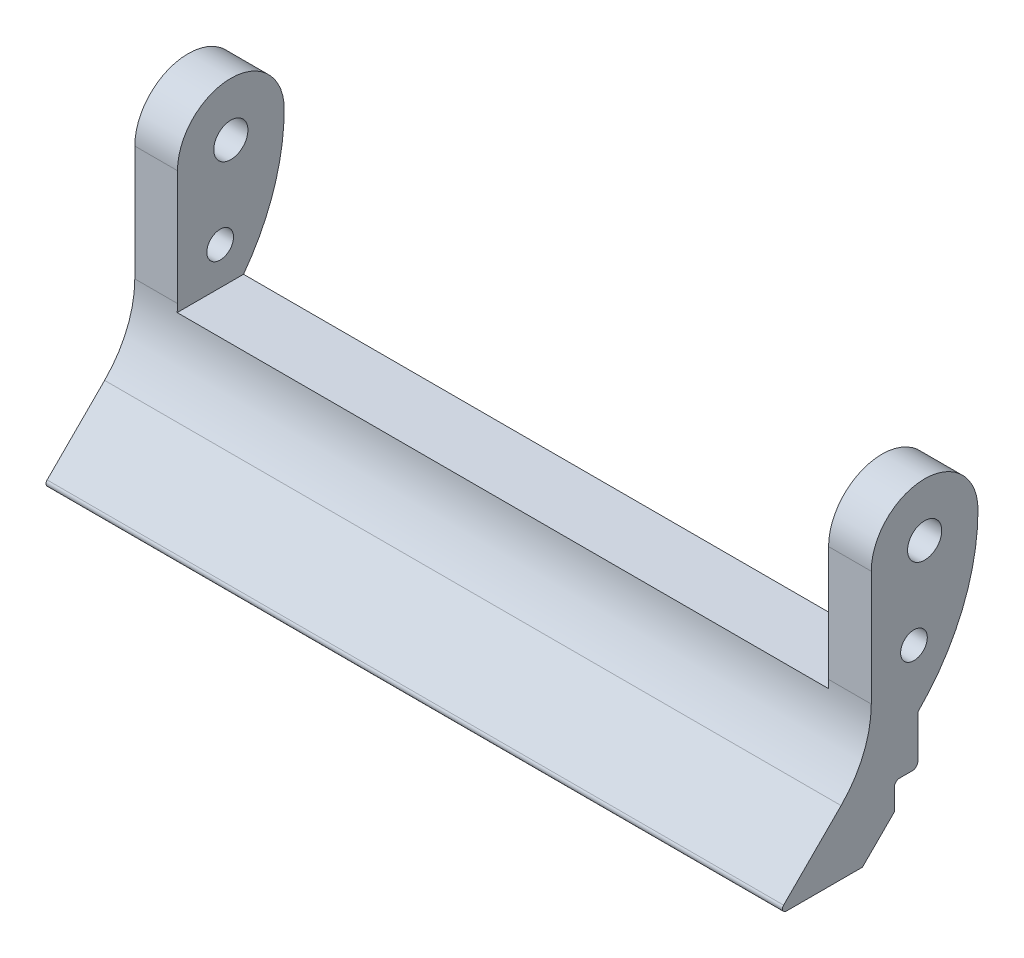
ISO-10303-21;
HEADER;
FILE_DESCRIPTION(('STEP AP214'),'2;1');
FILE_NAME('part.step','',(''),(''),'','','');
FILE_SCHEMA(('AUTOMOTIVE_DESIGN { 1 0 10303 214 1 1 1 1 }'));
ENDSEC;
DATA;
#1=APPLICATION_CONTEXT('core data for automotive mechanical design processes');
#2=APPLICATION_PROTOCOL_DEFINITION('international standard','automotive_design',2000,#1);
#3=PRODUCT_CONTEXT('',#1,'mechanical');
#4=PRODUCT('Part','Part','',(#3));
#5=PRODUCT_RELATED_PRODUCT_CATEGORY('part','',(#4));
#6=PRODUCT_DEFINITION_FORMATION('','',#4);
#7=PRODUCT_DEFINITION_CONTEXT('part definition',#1,'design');
#8=PRODUCT_DEFINITION('design','',#6,#7);
#9=PRODUCT_DEFINITION_SHAPE('','',#8);
#10=(LENGTH_UNIT() NAMED_UNIT(*) SI_UNIT(.MILLI.,.METRE.));
#11=(NAMED_UNIT(*) PLANE_ANGLE_UNIT() SI_UNIT($,.RADIAN.));
#12=(NAMED_UNIT(*) SI_UNIT($,.STERADIAN.) SOLID_ANGLE_UNIT());
#13=UNCERTAINTY_MEASURE_WITH_UNIT(LENGTH_MEASURE(1.E-05),#10,'distance_accuracy_value','');
#14=(GEOMETRIC_REPRESENTATION_CONTEXT(3) GLOBAL_UNCERTAINTY_ASSIGNED_CONTEXT((#13)) GLOBAL_UNIT_ASSIGNED_CONTEXT((#10,
#11,#12)) REPRESENTATION_CONTEXT('',''));
#15=CARTESIAN_POINT('',(0.,0.,0.));
#16=DIRECTION('',(0.,0.,1.));
#17=DIRECTION('',(1.,0.,0.));
#18=AXIS2_PLACEMENT_3D('',#15,#16,#17);
#19=CARTESIAN_POINT('',(69.,23.6,0.));
#20=DIRECTION('',(-1.,0.,0.));
#21=DIRECTION('',(0.,0.,1.));
#22=AXIS2_PLACEMENT_3D('',#19,#20,#21);
#23=CYLINDRICAL_SURFACE('',#22,5.);
#24=CARTESIAN_POINT('',(4.,23.6,0.));
#25=DIRECTION('',(1.,0.,0.));
#26=DIRECTION('',(0.,0.,-1.));
#27=AXIS2_PLACEMENT_3D('',#24,#25,#26);
#28=CIRCLE('',#27,5.);
#29=CARTESIAN_POINT('',(4.,23.6,-4.99999999999999));
#30=VERTEX_POINT('',#29);
#31=CARTESIAN_POINT('',(4.,23.6,5.00000000000001));
#32=VERTEX_POINT('',#31);
#33=EDGE_CURVE('E263',#30,#32,#28,.T.);
#34=ORIENTED_EDGE('',*,*,#33,.F.);
#35=DIRECTION('',(-1.,0.,0.));
#36=VECTOR('',#35,1.);
#37=CARTESIAN_POINT('',(69.,23.6,-4.99999999999999));
#38=LINE('',#37,#36);
#39=CARTESIAN_POINT('',(0.,23.6,-4.99999999999999));
#40=VERTEX_POINT('',#39);
#41=EDGE_CURVE('E116',#30,#40,#38,.T.);
#42=ORIENTED_EDGE('',*,*,#41,.T.);
#43=CARTESIAN_POINT('',(0.,23.6,0.));
#44=DIRECTION('',(1.,0.,0.));
#45=DIRECTION('',(0.,0.,1.));
#46=AXIS2_PLACEMENT_3D('',#43,#44,#45);
#47=CIRCLE('',#46,5.);
#48=CARTESIAN_POINT('',(0.,23.6,5.00000000000001));
#49=VERTEX_POINT('',#48);
#50=EDGE_CURVE('E184',#40,#49,#47,.T.);
#51=ORIENTED_EDGE('',*,*,#50,.T.);
#52=DIRECTION('',(-1.,0.,0.));
#53=VECTOR('',#52,1.);
#54=CARTESIAN_POINT('',(69.,23.6,5.00000000000001));
#55=LINE('',#54,#53);
#56=EDGE_CURVE('E242',#32,#49,#55,.T.);
#57=ORIENTED_EDGE('',*,*,#56,.F.);
#58=EDGE_LOOP('',(#34,#42,#51,#57));
#59=FACE_BOUND('',#58,.T.);
#60=ADVANCED_FACE('F43',(#59),#23,.T.);
#61=CARTESIAN_POINT('',(69.,23.6,5.00000000000001));
#62=DIRECTION('',(0.,0.,-1.));
#63=DIRECTION('',(0.,1.,0.));
#64=AXIS2_PLACEMENT_3D('',#61,#62,#63);
#65=PLANE('',#64);
#66=DIRECTION('',(0.,-1.,0.));
#67=VECTOR('',#66,1.);
#68=CARTESIAN_POINT('',(4.,23.6,5.00000000000001));
#69=LINE('',#68,#67);
#70=CARTESIAN_POINT('',(4.,12.8235804371885,4.99999999999999));
#71=VERTEX_POINT('',#70);
#72=EDGE_CURVE('E258',#32,#71,#69,.T.);
#73=ORIENTED_EDGE('',*,*,#72,.F.);
#74=ORIENTED_EDGE('',*,*,#56,.T.);
#75=DIRECTION('',(0.,-1.,0.));
#76=VECTOR('',#75,1.);
#77=CARTESIAN_POINT('',(0.,23.6,5.00000000000001));
#78=LINE('',#77,#76);
#79=CARTESIAN_POINT('',(0.,12.8235804371885,4.99999999999999));
#80=VERTEX_POINT('',#79);
#81=EDGE_CURVE('E186',#49,#80,#78,.T.);
#82=ORIENTED_EDGE('',*,*,#81,.T.);
#83=DIRECTION('',(-1.,0.,0.));
#84=VECTOR('',#83,1.);
#85=CARTESIAN_POINT('',(69.,12.8235804371885,4.99999999999999));
#86=LINE('',#85,#84);
#87=EDGE_CURVE('E238',#71,#80,#86,.T.);
#88=ORIENTED_EDGE('',*,*,#87,.F.);
#89=EDGE_LOOP('',(#73,#74,#82,#88));
#90=FACE_BOUND('',#89,.T.);
#91=ADVANCED_FACE('F361',(#90),#65,.F.);
#92=CARTESIAN_POINT('',(69.,23.6,0.));
#93=DIRECTION('',(-1.,0.,0.));
#94=DIRECTION('',(0.,0.,1.));
#95=AXIS2_PLACEMENT_3D('',#92,#93,#94);
#96=CYLINDRICAL_SURFACE('',#95,1.6);
#97=CARTESIAN_POINT('',(0.,23.6,0.));
#98=DIRECTION('',(1.,0.,0.));
#99=DIRECTION('',(0.,0.,-1.));
#100=AXIS2_PLACEMENT_3D('',#97,#98,#99);
#101=CIRCLE('',#100,1.6);
#102=CARTESIAN_POINT('',(0.,23.6,-1.59999999999999));
#103=VERTEX_POINT('',#102);
#104=EDGE_CURVE('E278',#103,#103,#101,.T.);
#105=ORIENTED_EDGE('',*,*,#104,.F.);
#106=EDGE_LOOP('',(#105));
#107=FACE_BOUND('',#106,.T.);
#108=CARTESIAN_POINT('',(4.,23.6,0.));
#109=DIRECTION('',(1.,0.,0.));
#110=DIRECTION('',(0.,0.,-1.));
#111=AXIS2_PLACEMENT_3D('',#108,#109,#110);
#112=CIRCLE('',#111,1.6);
#113=CARTESIAN_POINT('',(4.,23.6,-1.59999999999999));
#114=VERTEX_POINT('',#113);
#115=EDGE_CURVE('E244',#114,#114,#112,.T.);
#116=ORIENTED_EDGE('',*,*,#115,.T.);
#117=EDGE_LOOP('',(#116));
#118=FACE_BOUND('',#117,.T.);
#119=ADVANCED_FACE('F400',(#107,#118),#96,.F.);
#120=CARTESIAN_POINT('',(69.,23.6,0.));
#121=DIRECTION('',(-1.,0.,0.));
#122=DIRECTION('',(0.,0.,1.));
#123=AXIS2_PLACEMENT_3D('',#120,#121,#122);
#124=PLANE('',#123);
#125=CARTESIAN_POINT('',(69.,15.6,0.999999999999999));
#126=DIRECTION('',(1.,0.,0.));
#127=DIRECTION('',(0.,0.,-1.));
#128=AXIS2_PLACEMENT_3D('',#125,#126,#127);
#129=CIRCLE('',#128,1.24999999999999);
#130=CARTESIAN_POINT('',(69.,15.6,-0.249999999999988));
#131=VERTEX_POINT('',#130);
#132=EDGE_CURVE('E392',#131,#131,#129,.T.);
#133=ORIENTED_EDGE('',*,*,#132,.F.);
#134=EDGE_LOOP('',(#133));
#135=FACE_BOUND('',#134,.T.);
#136=CARTESIAN_POINT('',(69.,23.6,0.));
#137=DIRECTION('',(1.,0.,0.));
#138=DIRECTION('',(0.,0.,1.));
#139=AXIS2_PLACEMENT_3D('',#136,#137,#138);
#140=CIRCLE('',#139,5.);
#141=CARTESIAN_POINT('',(69.,23.6,-4.99999999999999));
#142=VERTEX_POINT('',#141);
#143=CARTESIAN_POINT('',(69.,23.6,5.00000000000001));
#144=VERTEX_POINT('',#143);
#145=EDGE_CURVE('E211',#142,#144,#140,.T.);
#146=ORIENTED_EDGE('',*,*,#145,.T.);
#147=DIRECTION('',(0.,-1.,0.));
#148=VECTOR('',#147,1.);
#149=CARTESIAN_POINT('',(69.,23.6,5.00000000000001));
#150=LINE('',#149,#148);
#151=CARTESIAN_POINT('',(69.,12.8235804371885,4.99999999999999));
#152=VERTEX_POINT('',#151);
#153=EDGE_CURVE('E125',#144,#152,#150,.T.);
#154=ORIENTED_EDGE('',*,*,#153,.T.);
#155=CARTESIAN_POINT('',(69.,12.8235804371885,14.65));
#156=DIRECTION('',(-1.,0.,0.));
#157=DIRECTION('',(0.,0.,-1.));
#158=AXIS2_PLACEMENT_3D('',#155,#156,#157);
#159=CIRCLE('',#158,9.64999999999999);
#160=CARTESIAN_POINT('',(69.,5.99999999873836,7.82641956154979));
#161=VERTEX_POINT('',#160);
#162=EDGE_CURVE('E285',#152,#161,#159,.T.);
#163=ORIENTED_EDGE('',*,*,#162,.T.);
#164=DIRECTION('',(0.,-0.707106781186548,0.707106781186547));
#165=VECTOR('',#164,1.);
#166=CARTESIAN_POINT('',(69.,0.614558441227197,13.211861119061));
#167=LINE('',#166,#165);
#168=CARTESIAN_POINT('',(69.,0.614558441227197,13.211861119061));
#169=VERTEX_POINT('',#168);
#170=EDGE_CURVE('E287',#161,#169,#167,.T.);
#171=ORIENTED_EDGE('',*,*,#170,.T.);
#172=CARTESIAN_POINT('',(69.,0.36,12.9573026778338));
#173=DIRECTION('',(1.,0.,0.));
#174=DIRECTION('',(0.,0.,-1.));
#175=AXIS2_PLACEMENT_3D('',#172,#173,#174);
#176=CIRCLE('',#175,0.360000000000032);
#177=CARTESIAN_POINT('',(69.,0.,12.9573026778338));
#178=VERTEX_POINT('',#177);
#179=EDGE_CURVE('E289',#169,#178,#176,.T.);
#180=ORIENTED_EDGE('',*,*,#179,.T.);
#181=DIRECTION('',(0.,0.,-1.));
#182=VECTOR('',#181,1.);
#183=CARTESIAN_POINT('',(69.,0.,12.9573026778338));
#184=LINE('',#183,#182);
#185=CARTESIAN_POINT('',(69.,0.,5.82641955783378));
#186=VERTEX_POINT('',#185);
#187=EDGE_CURVE('E291',#178,#186,#184,.T.);
#188=ORIENTED_EDGE('',*,*,#187,.T.);
#189=DIRECTION('',(0.,0.707106781186551,-0.707106781186544));
#190=VECTOR('',#189,1.);
#191=CARTESIAN_POINT('',(69.,0.,5.82641955783378));
#192=LINE('',#191,#190);
#193=CARTESIAN_POINT('',(69.,2.98549772000003,2.84092183783378));
#194=VERTEX_POINT('',#193);
#195=EDGE_CURVE('E293',#186,#194,#192,.T.);
#196=ORIENTED_EDGE('',*,*,#195,.T.);
#197=DIRECTION('',(0.,1.,0.));
#198=VECTOR('',#197,1.);
#199=CARTESIAN_POINT('',(69.,2.98549772000003,2.84092183783378));
#200=LINE('',#199,#198);
#201=CARTESIAN_POINT('',(69.,4.98549772000003,2.84092183783378));
#202=VERTEX_POINT('',#201);
#203=EDGE_CURVE('E295',#194,#202,#200,.T.);
#204=ORIENTED_EDGE('',*,*,#203,.T.);
#205=CARTESIAN_POINT('',(69.,4.98549772000003,2.34092183783378));
#206=DIRECTION('',(-1.,0.,0.));
#207=DIRECTION('',(0.,0.,1.));
#208=AXIS2_PLACEMENT_3D('',#205,#206,#207);
#209=CIRCLE('',#208,0.499999999999999);
#210=CARTESIAN_POINT('',(69.,5.48549772000003,2.34092183783378));
#211=VERTEX_POINT('',#210);
#212=EDGE_CURVE('E297',#202,#211,#209,.T.);
#213=ORIENTED_EDGE('',*,*,#212,.T.);
#214=DIRECTION('',(0.,0.,-1.));
#215=VECTOR('',#214,1.);
#216=CARTESIAN_POINT('',(69.,5.48549772000003,2.34092183783378));
#217=LINE('',#216,#215);
#218=CARTESIAN_POINT('',(69.,5.48549772000002,1.13931148933537));
#219=VERTEX_POINT('',#218);
#220=EDGE_CURVE('E163',#211,#219,#217,.T.);
#221=ORIENTED_EDGE('',*,*,#220,.T.);
#222=CARTESIAN_POINT('',(69.,5.98549772000002,1.13931148933537));
#223=DIRECTION('',(1.,0.,0.));
#224=DIRECTION('',(0.,0.,-1.));
#225=AXIS2_PLACEMENT_3D('',#222,#223,#224);
#226=CIRCLE('',#225,0.5);
#227=CARTESIAN_POINT('',(69.,5.98549772000002,0.639311489335374));
#228=VERTEX_POINT('',#227);
#229=EDGE_CURVE('E155',#219,#228,#226,.T.);
#230=ORIENTED_EDGE('',*,*,#229,.T.);
#231=DIRECTION('',(0.,1.,0.));
#232=VECTOR('',#231,1.);
#233=CARTESIAN_POINT('',(69.,5.98549772000002,0.639311489335374));
#234=LINE('',#233,#232);
#235=CARTESIAN_POINT('',(69.,9.98549772000002,0.639311489335375));
#236=VERTEX_POINT('',#235);
#237=EDGE_CURVE('E160',#228,#236,#234,.T.);
#238=ORIENTED_EDGE('',*,*,#237,.T.);
#239=CARTESIAN_POINT('',(69.,23.6,14.2538137693355));
#240=DIRECTION('',(1.,0.,0.));
#241=DIRECTION('',(0.,0.,-1.));
#242=AXIS2_PLACEMENT_3D('',#239,#240,#241);
#243=CIRCLE('',#242,19.2538137693355);
#244=EDGE_CURVE('E67',#236,#142,#243,.T.);
#245=ORIENTED_EDGE('',*,*,#244,.T.);
#246=EDGE_LOOP('',(#146,#154,#163,#171,#180,#188,#196,#204,#213,#221,#230,#238,#245));
#247=FACE_BOUND('',#246,.T.);
#248=CARTESIAN_POINT('',(69.,23.6,0.));
#249=DIRECTION('',(1.,0.,0.));
#250=DIRECTION('',(0.,0.,-1.));
#251=AXIS2_PLACEMENT_3D('',#248,#249,#250);
#252=CIRCLE('',#251,1.6);
#253=CARTESIAN_POINT('',(69.,23.6,-1.59999999999999));
#254=VERTEX_POINT('',#253);
#255=EDGE_CURVE('E187',#254,#254,#252,.T.);
#256=ORIENTED_EDGE('',*,*,#255,.F.);
#257=EDGE_LOOP('',(#256));
#258=FACE_BOUND('',#257,.T.);
#259=ADVANCED_FACE('F157',(#135,#247,#258),#124,.F.);
#260=CARTESIAN_POINT('',(0.,23.6,0.));
#261=DIRECTION('',(-1.,0.,0.));
#262=DIRECTION('',(0.,0.,1.));
#263=AXIS2_PLACEMENT_3D('',#260,#261,#262);
#264=PLANE('',#263);
#265=CARTESIAN_POINT('',(0.,15.6,0.999999999999999));
#266=DIRECTION('',(1.,0.,0.));
#267=DIRECTION('',(0.,0.,-1.));
#268=AXIS2_PLACEMENT_3D('',#265,#266,#267);
#269=CIRCLE('',#268,1.24999999999998);
#270=CARTESIAN_POINT('',(0.,15.6,-0.249999999999985));
#271=VERTEX_POINT('',#270);
#272=EDGE_CURVE('E389',#271,#271,#269,.T.);
#273=ORIENTED_EDGE('',*,*,#272,.T.);
#274=EDGE_LOOP('',(#273));
#275=FACE_BOUND('',#274,.T.);
#276=ORIENTED_EDGE('',*,*,#50,.F.);
#277=CARTESIAN_POINT('',(0.,23.6,14.2538137693355));
#278=DIRECTION('',(1.,0.,0.));
#279=DIRECTION('',(0.,0.,-1.));
#280=AXIS2_PLACEMENT_3D('',#277,#278,#279);
#281=CIRCLE('',#280,19.2538137693355);
#282=CARTESIAN_POINT('',(0.,9.98549772000002,0.639311489335375));
#283=VERTEX_POINT('',#282);
#284=EDGE_CURVE('E209',#283,#40,#281,.T.);
#285=ORIENTED_EDGE('',*,*,#284,.F.);
#286=DIRECTION('',(0.,1.,0.));
#287=VECTOR('',#286,1.);
#288=CARTESIAN_POINT('',(0.,5.98549772000002,0.639311489335374));
#289=LINE('',#288,#287);
#290=CARTESIAN_POINT('',(0.,5.98549772000002,0.639311489335374));
#291=VERTEX_POINT('',#290);
#292=EDGE_CURVE('E207',#291,#283,#289,.T.);
#293=ORIENTED_EDGE('',*,*,#292,.F.);
#294=CARTESIAN_POINT('',(0.,5.98549772000002,1.13931148933537));
#295=DIRECTION('',(1.,0.,0.));
#296=DIRECTION('',(0.,0.,-1.));
#297=AXIS2_PLACEMENT_3D('',#294,#295,#296);
#298=CIRCLE('',#297,0.5);
#299=CARTESIAN_POINT('',(0.,5.48549772000002,1.13931148933537));
#300=VERTEX_POINT('',#299);
#301=EDGE_CURVE('E172',#300,#291,#298,.T.);
#302=ORIENTED_EDGE('',*,*,#301,.F.);
#303=DIRECTION('',(0.,0.,-1.));
#304=VECTOR('',#303,1.);
#305=CARTESIAN_POINT('',(0.,5.48549772000003,2.34092183783378));
#306=LINE('',#305,#304);
#307=CARTESIAN_POINT('',(0.,5.48549772000003,2.34092183783378));
#308=VERTEX_POINT('',#307);
#309=EDGE_CURVE('E204',#308,#300,#306,.T.);
#310=ORIENTED_EDGE('',*,*,#309,.F.);
#311=CARTESIAN_POINT('',(0.,4.98549772000003,2.34092183783378));
#312=DIRECTION('',(-1.,0.,0.));
#313=DIRECTION('',(0.,0.,1.));
#314=AXIS2_PLACEMENT_3D('',#311,#312,#313);
#315=CIRCLE('',#314,0.499999999999999);
#316=CARTESIAN_POINT('',(0.,4.98549772000003,2.84092183783378));
#317=VERTEX_POINT('',#316);
#318=EDGE_CURVE('E202',#317,#308,#315,.T.);
#319=ORIENTED_EDGE('',*,*,#318,.F.);
#320=DIRECTION('',(0.,1.,0.));
#321=VECTOR('',#320,1.);
#322=CARTESIAN_POINT('',(0.,2.98549772000003,2.84092183783378));
#323=LINE('',#322,#321);
#324=CARTESIAN_POINT('',(0.,2.98549772000003,2.84092183783378));
#325=VERTEX_POINT('',#324);
#326=EDGE_CURVE('E200',#325,#317,#323,.T.);
#327=ORIENTED_EDGE('',*,*,#326,.F.);
#328=DIRECTION('',(0.,0.707106781186551,-0.707106781186544));
#329=VECTOR('',#328,1.);
#330=CARTESIAN_POINT('',(0.,0.,5.82641955783378));
#331=LINE('',#330,#329);
#332=CARTESIAN_POINT('',(0.,0.,5.82641955783378));
#333=VERTEX_POINT('',#332);
#334=EDGE_CURVE('E198',#333,#325,#331,.T.);
#335=ORIENTED_EDGE('',*,*,#334,.F.);
#336=DIRECTION('',(0.,0.,-1.));
#337=VECTOR('',#336,1.);
#338=CARTESIAN_POINT('',(0.,0.,12.9573026778338));
#339=LINE('',#338,#337);
#340=CARTESIAN_POINT('',(0.,0.,12.9573026778338));
#341=VERTEX_POINT('',#340);
#342=EDGE_CURVE('E196',#341,#333,#339,.T.);
#343=ORIENTED_EDGE('',*,*,#342,.F.);
#344=CARTESIAN_POINT('',(0.,0.36,12.9573026778338));
#345=DIRECTION('',(1.,0.,0.));
#346=DIRECTION('',(0.,0.,-1.));
#347=AXIS2_PLACEMENT_3D('',#344,#345,#346);
#348=CIRCLE('',#347,0.360000000000032);
#349=CARTESIAN_POINT('',(0.,0.614558441227197,13.211861119061));
#350=VERTEX_POINT('',#349);
#351=EDGE_CURVE('E194',#350,#341,#348,.T.);
#352=ORIENTED_EDGE('',*,*,#351,.F.);
#353=DIRECTION('',(0.,-0.707106781186548,0.707106781186547));
#354=VECTOR('',#353,1.);
#355=CARTESIAN_POINT('',(0.,0.614558441227197,13.211861119061));
#356=LINE('',#355,#354);
#357=CARTESIAN_POINT('',(0.,5.99999999873836,7.82641956154979));
#358=VERTEX_POINT('',#357);
#359=EDGE_CURVE('E192',#358,#350,#356,.T.);
#360=ORIENTED_EDGE('',*,*,#359,.F.);
#361=CARTESIAN_POINT('',(0.,12.8235804371885,14.65));
#362=DIRECTION('',(-1.,0.,0.));
#363=DIRECTION('',(0.,0.,-1.));
#364=AXIS2_PLACEMENT_3D('',#361,#362,#363);
#365=CIRCLE('',#364,9.64999999999999);
#366=EDGE_CURVE('E190',#80,#358,#365,.T.);
#367=ORIENTED_EDGE('',*,*,#366,.F.);
#368=ORIENTED_EDGE('',*,*,#81,.F.);
#369=EDGE_LOOP('',(#276,#285,#293,#302,#310,#319,#327,#335,#343,#352,#360,#367,#368));
#370=FACE_BOUND('',#369,.T.);
#371=ORIENTED_EDGE('',*,*,#104,.T.);
#372=EDGE_LOOP('',(#371));
#373=FACE_BOUND('',#372,.T.);
#374=ADVANCED_FACE('F310',(#275,#370,#373),#264,.T.);
#375=CARTESIAN_POINT('',(65.,23.6,-4.99999999999999));
#376=VERTEX_POINT('',#375);
#377=EDGE_CURVE('E212',#142,#376,#38,.T.);
#378=ORIENTED_EDGE('',*,*,#377,.T.);
#379=CARTESIAN_POINT('',(65.,23.6,0.));
#380=DIRECTION('',(1.,0.,0.));
#381=DIRECTION('',(0.,0.,-1.));
#382=AXIS2_PLACEMENT_3D('',#379,#380,#381);
#383=CIRCLE('',#382,5.);
#384=CARTESIAN_POINT('',(65.,23.6,5.00000000000001));
#385=VERTEX_POINT('',#384);
#386=EDGE_CURVE('E256',#376,#385,#383,.T.);
#387=ORIENTED_EDGE('',*,*,#386,.T.);
#388=EDGE_CURVE('E52',#144,#385,#55,.T.);
#389=ORIENTED_EDGE('',*,*,#388,.F.);
#390=ORIENTED_EDGE('',*,*,#145,.F.);
#391=EDGE_LOOP('',(#378,#387,#389,#390));
#392=FACE_BOUND('',#391,.T.);
#393=ADVANCED_FACE('F45',(#392),#23,.T.);
#394=ORIENTED_EDGE('',*,*,#388,.T.);
#395=DIRECTION('',(0.,-1.,0.));
#396=VECTOR('',#395,1.);
#397=CARTESIAN_POINT('',(65.,23.6,5.00000000000001));
#398=LINE('',#397,#396);
#399=CARTESIAN_POINT('',(65.,12.8235804371885,4.99999999999999));
#400=VERTEX_POINT('',#399);
#401=EDGE_CURVE('E269',#385,#400,#398,.T.);
#402=ORIENTED_EDGE('',*,*,#401,.T.);
#403=EDGE_CURVE('E239',#152,#400,#86,.T.);
#404=ORIENTED_EDGE('',*,*,#403,.F.);
#405=ORIENTED_EDGE('',*,*,#153,.F.);
#406=EDGE_LOOP('',(#394,#402,#404,#405));
#407=FACE_BOUND('',#406,.T.);
#408=ADVANCED_FACE('F323',(#407),#65,.F.);
#409=CARTESIAN_POINT('',(69.,12.8235804371885,14.65));
#410=DIRECTION('',(-1.,0.,0.));
#411=DIRECTION('',(0.,0.,1.));
#412=AXIS2_PLACEMENT_3D('',#409,#410,#411);
#413=CYLINDRICAL_SURFACE('',#412,9.64999999999999);
#414=ORIENTED_EDGE('',*,*,#403,.T.);
#415=CARTESIAN_POINT('',(65.,12.8235804371885,14.65));
#416=DIRECTION('',(1.,0.,0.));
#417=DIRECTION('',(0.,0.,-1.));
#418=AXIS2_PLACEMENT_3D('',#415,#416,#417);
#419=CIRCLE('',#418,9.64999999999999);
#420=CARTESIAN_POINT('',(65.,12.1,5.02716614759883));
#421=VERTEX_POINT('',#420);
#422=EDGE_CURVE('E272',#400,#421,#419,.F.);
#423=ORIENTED_EDGE('',*,*,#422,.T.);
#424=DIRECTION('',(-1.,0.,0.));
#425=VECTOR('',#424,1.);
#426=CARTESIAN_POINT('',(69.,12.1,5.02716614759883));
#427=LINE('',#426,#425);
#428=CARTESIAN_POINT('',(4.,12.1,5.02716614759883));
#429=VERTEX_POINT('',#428);
#430=EDGE_CURVE('E275',#429,#421,#427,.F.);
#431=ORIENTED_EDGE('',*,*,#430,.F.);
#432=CARTESIAN_POINT('',(4.,12.8235804371885,14.65));
#433=DIRECTION('',(1.,0.,0.));
#434=DIRECTION('',(0.,0.,-1.));
#435=AXIS2_PLACEMENT_3D('',#432,#433,#434);
#436=CIRCLE('',#435,9.64999999999999);
#437=EDGE_CURVE('E252',#71,#429,#436,.F.);
#438=ORIENTED_EDGE('',*,*,#437,.F.);
#439=ORIENTED_EDGE('',*,*,#87,.T.);
#440=ORIENTED_EDGE('',*,*,#366,.T.);
#441=DIRECTION('',(-1.,0.,0.));
#442=VECTOR('',#441,1.);
#443=CARTESIAN_POINT('',(69.,5.99999999873836,7.82641956154979));
#444=LINE('',#443,#442);
#445=EDGE_CURVE('E235',#161,#358,#444,.T.);
#446=ORIENTED_EDGE('',*,*,#445,.F.);
#447=ORIENTED_EDGE('',*,*,#162,.F.);
#448=EDGE_LOOP('',(#414,#423,#431,#438,#439,#440,#446,#447));
#449=FACE_BOUND('',#448,.T.);
#450=ADVANCED_FACE('F326',(#449),#413,.F.);
#451=CARTESIAN_POINT('',(69.,0.614558441227197,13.211861119061));
#452=DIRECTION('',(0.,-0.707106781186547,-0.707106781186548));
#453=DIRECTION('',(0.,0.707106781186548,-0.707106781186547));
#454=AXIS2_PLACEMENT_3D('',#451,#452,#453);
#455=PLANE('',#454);
#456=ORIENTED_EDGE('',*,*,#359,.T.);
#457=DIRECTION('',(-1.,0.,0.));
#458=VECTOR('',#457,1.);
#459=CARTESIAN_POINT('',(69.,0.614558441227197,13.211861119061));
#460=LINE('',#459,#458);
#461=EDGE_CURVE('E232',#169,#350,#460,.T.);
#462=ORIENTED_EDGE('',*,*,#461,.F.);
#463=ORIENTED_EDGE('',*,*,#170,.F.);
#464=ORIENTED_EDGE('',*,*,#445,.T.);
#465=EDGE_LOOP('',(#456,#462,#463,#464));
#466=FACE_BOUND('',#465,.T.);
#467=ADVANCED_FACE('F332',(#466),#455,.F.);
#468=CARTESIAN_POINT('',(69.,0.36,12.9573026778338));
#469=DIRECTION('',(-1.,0.,0.));
#470=DIRECTION('',(0.,0.,1.));
#471=AXIS2_PLACEMENT_3D('',#468,#469,#470);
#472=CYLINDRICAL_SURFACE('',#471,0.360000000000032);
#473=ORIENTED_EDGE('',*,*,#351,.T.);
#474=DIRECTION('',(-1.,0.,0.));
#475=VECTOR('',#474,1.);
#476=CARTESIAN_POINT('',(69.,0.,12.9573026778338));
#477=LINE('',#476,#475);
#478=EDGE_CURVE('E229',#178,#341,#477,.T.);
#479=ORIENTED_EDGE('',*,*,#478,.F.);
#480=ORIENTED_EDGE('',*,*,#179,.F.);
#481=ORIENTED_EDGE('',*,*,#461,.T.);
#482=EDGE_LOOP('',(#473,#479,#480,#481));
#483=FACE_BOUND('',#482,.T.);
#484=ADVANCED_FACE('F338',(#483),#472,.T.);
#485=CARTESIAN_POINT('',(69.,0.,12.9573026778338));
#486=DIRECTION('',(0.,1.,0.));
#487=DIRECTION('',(0.,0.,1.));
#488=AXIS2_PLACEMENT_3D('',#485,#486,#487);
#489=PLANE('',#488);
#490=ORIENTED_EDGE('',*,*,#342,.T.);
#491=DIRECTION('',(-1.,0.,0.));
#492=VECTOR('',#491,1.);
#493=CARTESIAN_POINT('',(69.,0.,5.82641955783378));
#494=LINE('',#493,#492);
#495=EDGE_CURVE('E226',#186,#333,#494,.T.);
#496=ORIENTED_EDGE('',*,*,#495,.F.);
#497=ORIENTED_EDGE('',*,*,#187,.F.);
#498=ORIENTED_EDGE('',*,*,#478,.T.);
#499=EDGE_LOOP('',(#490,#496,#497,#498));
#500=FACE_BOUND('',#499,.T.);
#501=ADVANCED_FACE('F342',(#500),#489,.F.);
#502=CARTESIAN_POINT('',(69.,0.,5.82641955783378));
#503=DIRECTION('',(0.,0.707106781186544,0.707106781186551));
#504=DIRECTION('',(0.,-0.707106781186551,0.707106781186544));
#505=AXIS2_PLACEMENT_3D('',#502,#503,#504);
#506=PLANE('',#505);
#507=ORIENTED_EDGE('',*,*,#334,.T.);
#508=DIRECTION('',(-1.,0.,0.));
#509=VECTOR('',#508,1.);
#510=CARTESIAN_POINT('',(69.,2.98549772000003,2.84092183783378));
#511=LINE('',#510,#509);
#512=EDGE_CURVE('E223',#194,#325,#511,.T.);
#513=ORIENTED_EDGE('',*,*,#512,.F.);
#514=ORIENTED_EDGE('',*,*,#195,.F.);
#515=ORIENTED_EDGE('',*,*,#495,.T.);
#516=EDGE_LOOP('',(#507,#513,#514,#515));
#517=FACE_BOUND('',#516,.T.);
#518=ADVANCED_FACE('F347',(#517),#506,.F.);
#519=CARTESIAN_POINT('',(69.,2.98549772000003,2.84092183783378));
#520=DIRECTION('',(0.,0.,1.));
#521=DIRECTION('',(1.,0.,0.));
#522=AXIS2_PLACEMENT_3D('',#519,#520,#521);
#523=PLANE('',#522);
#524=ORIENTED_EDGE('',*,*,#326,.T.);
#525=DIRECTION('',(-1.,0.,0.));
#526=VECTOR('',#525,1.);
#527=CARTESIAN_POINT('',(69.,4.98549772000003,2.84092183783378));
#528=LINE('',#527,#526);
#529=EDGE_CURVE('E220',#202,#317,#528,.T.);
#530=ORIENTED_EDGE('',*,*,#529,.F.);
#531=ORIENTED_EDGE('',*,*,#203,.F.);
#532=ORIENTED_EDGE('',*,*,#512,.T.);
#533=EDGE_LOOP('',(#524,#530,#531,#532));
#534=FACE_BOUND('',#533,.T.);
#535=ADVANCED_FACE('F350',(#534),#523,.F.);
#536=CARTESIAN_POINT('',(69.,4.98549772000003,2.34092183783378));
#537=DIRECTION('',(-1.,0.,0.));
#538=DIRECTION('',(0.,0.,1.));
#539=AXIS2_PLACEMENT_3D('',#536,#537,#538);
#540=CYLINDRICAL_SURFACE('',#539,0.499999999999999);
#541=ORIENTED_EDGE('',*,*,#318,.T.);
#542=DIRECTION('',(-1.,0.,0.));
#543=VECTOR('',#542,1.);
#544=CARTESIAN_POINT('',(69.,5.48549772000003,2.34092183783378));
#545=LINE('',#544,#543);
#546=EDGE_CURVE('E217',#211,#308,#545,.T.);
#547=ORIENTED_EDGE('',*,*,#546,.F.);
#548=ORIENTED_EDGE('',*,*,#212,.F.);
#549=ORIENTED_EDGE('',*,*,#529,.T.);
#550=EDGE_LOOP('',(#541,#547,#548,#549));
#551=FACE_BOUND('',#550,.T.);
#552=ADVANCED_FACE('F303',(#551),#540,.F.);
#553=CARTESIAN_POINT('',(69.,5.48549772000003,2.34092183783378));
#554=DIRECTION('',(0.,1.,0.));
#555=DIRECTION('',(0.,0.,1.));
#556=AXIS2_PLACEMENT_3D('',#553,#554,#555);
#557=PLANE('',#556);
#558=ORIENTED_EDGE('',*,*,#309,.T.);
#559=DIRECTION('',(-1.,0.,0.));
#560=VECTOR('',#559,1.);
#561=CARTESIAN_POINT('',(69.,5.48549772000002,1.13931148933537));
#562=LINE('',#561,#560);
#563=EDGE_CURVE('E175',#219,#300,#562,.T.);
#564=ORIENTED_EDGE('',*,*,#563,.F.);
#565=ORIENTED_EDGE('',*,*,#220,.F.);
#566=ORIENTED_EDGE('',*,*,#546,.T.);
#567=EDGE_LOOP('',(#558,#564,#565,#566));
#568=FACE_BOUND('',#567,.T.);
#569=ADVANCED_FACE('F307',(#568),#557,.F.);
#570=CARTESIAN_POINT('',(69.,5.98549772000002,1.13931148933537));
#571=DIRECTION('',(-1.,0.,0.));
#572=DIRECTION('',(0.,0.,1.));
#573=AXIS2_PLACEMENT_3D('',#570,#571,#572);
#574=CYLINDRICAL_SURFACE('',#573,0.5);
#575=ORIENTED_EDGE('',*,*,#301,.T.);
#576=DIRECTION('',(-1.,0.,0.));
#577=VECTOR('',#576,1.);
#578=CARTESIAN_POINT('',(69.,5.98549772000002,0.639311489335374));
#579=LINE('',#578,#577);
#580=EDGE_CURVE('E169',#228,#291,#579,.T.);
#581=ORIENTED_EDGE('',*,*,#580,.F.);
#582=ORIENTED_EDGE('',*,*,#229,.F.);
#583=ORIENTED_EDGE('',*,*,#563,.T.);
#584=EDGE_LOOP('',(#575,#581,#582,#583));
#585=FACE_BOUND('',#584,.T.);
#586=ADVANCED_FACE('F170',(#585),#574,.T.);
#587=CARTESIAN_POINT('',(69.,5.98549772000002,0.639311489335374));
#588=DIRECTION('',(0.,0.,1.));
#589=DIRECTION('',(0.,-1.,0.));
#590=AXIS2_PLACEMENT_3D('',#587,#588,#589);
#591=PLANE('',#590);
#592=ORIENTED_EDGE('',*,*,#292,.T.);
#593=DIRECTION('',(-1.,0.,0.));
#594=VECTOR('',#593,1.);
#595=CARTESIAN_POINT('',(69.,9.98549772000002,0.639311489335375));
#596=LINE('',#595,#594);
#597=EDGE_CURVE('E176',#236,#283,#596,.T.);
#598=ORIENTED_EDGE('',*,*,#597,.F.);
#599=ORIENTED_EDGE('',*,*,#237,.F.);
#600=ORIENTED_EDGE('',*,*,#580,.T.);
#601=EDGE_LOOP('',(#592,#598,#599,#600));
#602=FACE_BOUND('',#601,.T.);
#603=ADVANCED_FACE('F178',(#602),#591,.F.);
#604=CARTESIAN_POINT('',(69.,23.6,14.2538137693355));
#605=DIRECTION('',(-1.,0.,0.));
#606=DIRECTION('',(0.,0.,1.));
#607=AXIS2_PLACEMENT_3D('',#604,#605,#606);
#608=CYLINDRICAL_SURFACE('',#607,19.2538137693355);
#609=DIRECTION('',(-1.,0.,0.));
#610=VECTOR('',#609,1.);
#611=CARTESIAN_POINT('',(69.,12.1,-1.18831512095204));
#612=LINE('',#611,#610);
#613=CARTESIAN_POINT('',(65.,12.1,-1.18831512095204));
#614=VERTEX_POINT('',#613);
#615=CARTESIAN_POINT('',(4.,12.1,-1.18831512095204));
#616=VERTEX_POINT('',#615);
#617=EDGE_CURVE('E11',#614,#616,#612,.T.);
#618=ORIENTED_EDGE('',*,*,#617,.F.);
#619=CARTESIAN_POINT('',(65.,23.6,14.2538137693355));
#620=DIRECTION('',(1.,0.,0.));
#621=DIRECTION('',(0.,0.,-1.));
#622=AXIS2_PLACEMENT_3D('',#619,#620,#621);
#623=CIRCLE('',#622,19.2538137693355);
#624=EDGE_CURVE('E251',#614,#376,#623,.T.);
#625=ORIENTED_EDGE('',*,*,#624,.T.);
#626=ORIENTED_EDGE('',*,*,#377,.F.);
#627=ORIENTED_EDGE('',*,*,#244,.F.);
#628=ORIENTED_EDGE('',*,*,#597,.T.);
#629=ORIENTED_EDGE('',*,*,#284,.T.);
#630=ORIENTED_EDGE('',*,*,#41,.F.);
#631=CARTESIAN_POINT('',(4.,23.6,14.2538137693355));
#632=DIRECTION('',(1.,0.,0.));
#633=DIRECTION('',(0.,0.,-1.));
#634=AXIS2_PLACEMENT_3D('',#631,#632,#633);
#635=CIRCLE('',#634,19.2538137693355);
#636=EDGE_CURVE('E247',#616,#30,#635,.T.);
#637=ORIENTED_EDGE('',*,*,#636,.F.);
#638=EDGE_LOOP('',(#618,#625,#626,#627,#628,#629,#630,#637));
#639=FACE_BOUND('',#638,.T.);
#640=ADVANCED_FACE('F315',(#639),#608,.T.);
#641=CARTESIAN_POINT('',(65.,23.6,0.));
#642=DIRECTION('',(1.,0.,0.));
#643=DIRECTION('',(0.,0.,-1.));
#644=AXIS2_PLACEMENT_3D('',#641,#642,#643);
#645=CIRCLE('',#644,1.6);
#646=CARTESIAN_POINT('',(65.,23.6,-1.59999999999999));
#647=VERTEX_POINT('',#646);
#648=EDGE_CURVE('E249',#647,#647,#645,.T.);
#649=ORIENTED_EDGE('',*,*,#648,.F.);
#650=EDGE_LOOP('',(#649));
#651=FACE_BOUND('',#650,.T.);
#652=ORIENTED_EDGE('',*,*,#255,.T.);
#653=EDGE_LOOP('',(#652));
#654=FACE_BOUND('',#653,.T.);
#655=ADVANCED_FACE('F410',(#651,#654),#96,.F.);
#656=CARTESIAN_POINT('',(65.,12.1,-4.99999999999999));
#657=DIRECTION('',(0.,1.,0.));
#658=DIRECTION('',(0.,0.,1.));
#659=AXIS2_PLACEMENT_3D('',#656,#657,#658);
#660=PLANE('',#659);
#661=ORIENTED_EDGE('',*,*,#430,.T.);
#662=DIRECTION('',(0.,0.,-1.));
#663=VECTOR('',#662,1.);
#664=CARTESIAN_POINT('',(65.,12.1,-4.99999999999999));
#665=LINE('',#664,#663);
#666=EDGE_CURVE('E248',#421,#614,#665,.T.);
#667=ORIENTED_EDGE('',*,*,#666,.T.);
#668=ORIENTED_EDGE('',*,*,#617,.T.);
#669=DIRECTION('',(0.,0.,-1.));
#670=VECTOR('',#669,1.);
#671=CARTESIAN_POINT('',(4.,12.1,-4.99999999999999));
#672=LINE('',#671,#670);
#673=EDGE_CURVE('E59',#429,#616,#672,.T.);
#674=ORIENTED_EDGE('',*,*,#673,.F.);
#675=EDGE_LOOP('',(#661,#667,#668,#674));
#676=FACE_BOUND('',#675,.T.);
#677=ADVANCED_FACE('F371',(#676),#660,.T.);
#678=CARTESIAN_POINT('',(65.,0.,0.));
#679=DIRECTION('',(1.,0.,0.));
#680=DIRECTION('',(0.,0.,-1.));
#681=AXIS2_PLACEMENT_3D('',#678,#679,#680);
#682=PLANE('',#681);
#683=CARTESIAN_POINT('',(65.,15.6,0.999999999999999));
#684=DIRECTION('',(1.,0.,0.));
#685=DIRECTION('',(0.,0.,-1.));
#686=AXIS2_PLACEMENT_3D('',#683,#684,#685);
#687=CIRCLE('',#686,1.24999999999999);
#688=CARTESIAN_POINT('',(65.,15.6,-0.249999999999986));
#689=VERTEX_POINT('',#688);
#690=EDGE_CURVE('E47',#689,#689,#687,.T.);
#691=ORIENTED_EDGE('',*,*,#690,.T.);
#692=EDGE_LOOP('',(#691));
#693=FACE_BOUND('',#692,.T.);
#694=ORIENTED_EDGE('',*,*,#648,.T.);
#695=EDGE_LOOP('',(#694));
#696=FACE_BOUND('',#695,.T.);
#697=ORIENTED_EDGE('',*,*,#401,.F.);
#698=ORIENTED_EDGE('',*,*,#386,.F.);
#699=ORIENTED_EDGE('',*,*,#624,.F.);
#700=ORIENTED_EDGE('',*,*,#666,.F.);
#701=ORIENTED_EDGE('',*,*,#422,.F.);
#702=EDGE_LOOP('',(#697,#698,#699,#700,#701));
#703=FACE_BOUND('',#702,.T.);
#704=ADVANCED_FACE('F375',(#693,#696,#703),#682,.F.);
#705=CARTESIAN_POINT('',(4.,0.,0.));
#706=DIRECTION('',(1.,0.,0.));
#707=DIRECTION('',(0.,0.,-1.));
#708=AXIS2_PLACEMENT_3D('',#705,#706,#707);
#709=PLANE('',#708);
#710=CARTESIAN_POINT('',(4.,15.6,0.999999999999999));
#711=DIRECTION('',(1.,0.,0.));
#712=DIRECTION('',(0.,0.,-1.));
#713=AXIS2_PLACEMENT_3D('',#710,#711,#712);
#714=CIRCLE('',#713,1.24999999999999);
#715=CARTESIAN_POINT('',(4.,15.6,-0.249999999999986));
#716=VERTEX_POINT('',#715);
#717=EDGE_CURVE('E378',#716,#716,#714,.T.);
#718=ORIENTED_EDGE('',*,*,#717,.F.);
#719=EDGE_LOOP('',(#718));
#720=FACE_BOUND('',#719,.T.);
#721=ORIENTED_EDGE('',*,*,#115,.F.);
#722=EDGE_LOOP('',(#721));
#723=FACE_BOUND('',#722,.T.);
#724=ORIENTED_EDGE('',*,*,#437,.T.);
#725=ORIENTED_EDGE('',*,*,#673,.T.);
#726=ORIENTED_EDGE('',*,*,#636,.T.);
#727=ORIENTED_EDGE('',*,*,#33,.T.);
#728=ORIENTED_EDGE('',*,*,#72,.T.);
#729=EDGE_LOOP('',(#724,#725,#726,#727,#728));
#730=FACE_BOUND('',#729,.T.);
#731=ADVANCED_FACE('F362',(#720,#723,#730),#709,.T.);
#732=CARTESIAN_POINT('',(69.,15.6,0.999999999999999));
#733=DIRECTION('',(1.,0.,0.));
#734=DIRECTION('',(0.,0.,-1.));
#735=AXIS2_PLACEMENT_3D('',#732,#733,#734);
#736=CYLINDRICAL_SURFACE('',#735,1.24999999999999);
#737=ORIENTED_EDGE('',*,*,#132,.T.);
#738=EDGE_LOOP('',(#737));
#739=FACE_BOUND('',#738,.T.);
#740=ORIENTED_EDGE('',*,*,#690,.F.);
#741=EDGE_LOOP('',(#740));
#742=FACE_BOUND('',#741,.T.);
#743=ADVANCED_FACE('F396',(#739,#742),#736,.F.);
#744=ORIENTED_EDGE('',*,*,#717,.T.);
#745=EDGE_LOOP('',(#744));
#746=FACE_BOUND('',#745,.T.);
#747=ORIENTED_EDGE('',*,*,#272,.F.);
#748=EDGE_LOOP('',(#747));
#749=FACE_BOUND('',#748,.T.);
#750=ADVANCED_FACE('F459',(#746,#749),#736,.F.);
#751=CLOSED_SHELL('',(#60,#91,#119,#259,#374,#393,#408,#450,#467,#484,#501,#518,#535,#552,#569,
#586,#603,#640,#655,#677,#704,#731,#743,#750));
#752=MANIFOLD_SOLID_BREP('B2',#751);
#753=ADVANCED_BREP_SHAPE_REPRESENTATION('',(#18,#752),#14);
#754=SHAPE_DEFINITION_REPRESENTATION(#9,#753);
ENDSEC;
END-ISO-10303-21;
